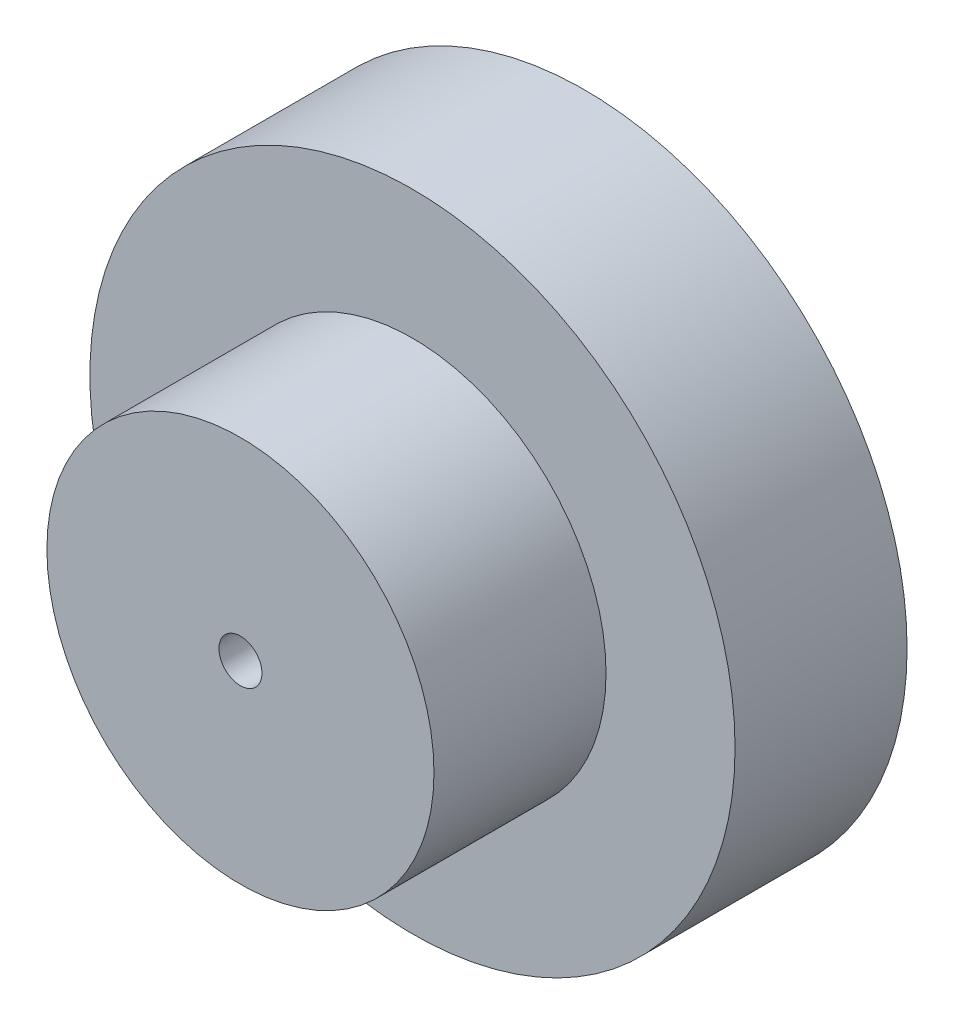
ISO-10303-21;
HEADER;
FILE_DESCRIPTION(('STEP AP214'),'2;1');
FILE_NAME('part.step','',(''),(''),'','','');
FILE_SCHEMA(('AUTOMOTIVE_DESIGN { 1 0 10303 214 1 1 1 1 }'));
ENDSEC;
DATA;
#1=APPLICATION_CONTEXT('core data for automotive mechanical design processes');
#2=APPLICATION_PROTOCOL_DEFINITION('international standard','automotive_design',2000,#1);
#3=PRODUCT_CONTEXT('',#1,'mechanical');
#4=PRODUCT('Part','Part','',(#3));
#5=PRODUCT_RELATED_PRODUCT_CATEGORY('part','',(#4));
#6=PRODUCT_DEFINITION_FORMATION('','',#4);
#7=PRODUCT_DEFINITION_CONTEXT('part definition',#1,'design');
#8=PRODUCT_DEFINITION('design','',#6,#7);
#9=PRODUCT_DEFINITION_SHAPE('','',#8);
#10=(LENGTH_UNIT() NAMED_UNIT(*) SI_UNIT(.MILLI.,.METRE.));
#11=(NAMED_UNIT(*) PLANE_ANGLE_UNIT() SI_UNIT($,.RADIAN.));
#12=(NAMED_UNIT(*) SI_UNIT($,.STERADIAN.) SOLID_ANGLE_UNIT());
#13=UNCERTAINTY_MEASURE_WITH_UNIT(LENGTH_MEASURE(1.E-05),#10,'distance_accuracy_value','');
#14=(GEOMETRIC_REPRESENTATION_CONTEXT(3) GLOBAL_UNCERTAINTY_ASSIGNED_CONTEXT((#13)) GLOBAL_UNIT_ASSIGNED_CONTEXT((#10,
#11,#12)) REPRESENTATION_CONTEXT('',''));
#15=CARTESIAN_POINT('',(0.,0.,0.));
#16=DIRECTION('',(0.,0.,1.));
#17=DIRECTION('',(1.,0.,0.));
#18=AXIS2_PLACEMENT_3D('',#15,#16,#17);
#19=CARTESIAN_POINT('',(0.,0.,0.));
#20=DIRECTION('',(0.,0.,1.));
#21=DIRECTION('',(1.,0.,0.));
#22=AXIS2_PLACEMENT_3D('',#19,#20,#21);
#23=PLANE('',#22);
#24=CARTESIAN_POINT('',(0.,0.,0.));
#25=DIRECTION('',(0.,0.,1.));
#26=DIRECTION('',(1.,0.,0.));
#27=AXIS2_PLACEMENT_3D('',#24,#25,#26);
#28=CIRCLE('',#27,7.5);
#29=CARTESIAN_POINT('',(7.5,0.,0.));
#30=VERTEX_POINT('',#29);
#31=EDGE_CURVE('E51',#30,#30,#28,.T.);
#32=ORIENTED_EDGE('',*,*,#31,.F.);
#33=EDGE_LOOP('',(#32));
#34=FACE_BOUND('',#33,.T.);
#35=CARTESIAN_POINT('',(0.,0.,0.));
#36=DIRECTION('',(0.,0.,-1.));
#37=DIRECTION('',(-1.,0.,0.));
#38=AXIS2_PLACEMENT_3D('',#35,#36,#37);
#39=CIRCLE('',#38,3.);
#40=CARTESIAN_POINT('',(-3.,0.,0.));
#41=VERTEX_POINT('',#40);
#42=EDGE_CURVE('E62',#41,#41,#39,.T.);
#43=ORIENTED_EDGE('',*,*,#42,.F.);
#44=EDGE_LOOP('',(#43));
#45=FACE_BOUND('',#44,.T.);
#46=ADVANCED_FACE('F38',(#34,#45),#23,.F.);
#47=CARTESIAN_POINT('',(0.,0.,8.));
#48=DIRECTION('',(0.,0.,-1.));
#49=DIRECTION('',(-1.,0.,0.));
#50=AXIS2_PLACEMENT_3D('',#47,#48,#49);
#51=CYLINDRICAL_SURFACE('',#50,4.5);
#52=CARTESIAN_POINT('',(0.,0.,4.));
#53=DIRECTION('',(0.,0.,1.));
#54=DIRECTION('',(1.,0.,0.));
#55=AXIS2_PLACEMENT_3D('',#52,#53,#54);
#56=CIRCLE('',#55,4.5);
#57=CARTESIAN_POINT('',(4.5,0.,4.));
#58=VERTEX_POINT('',#57);
#59=EDGE_CURVE('E42',#58,#58,#56,.T.);
#60=ORIENTED_EDGE('',*,*,#59,.T.);
#61=EDGE_LOOP('',(#60));
#62=FACE_BOUND('',#61,.T.);
#63=CARTESIAN_POINT('',(0.,0.,8.));
#64=DIRECTION('',(0.,0.,1.));
#65=DIRECTION('',(1.,0.,0.));
#66=AXIS2_PLACEMENT_3D('',#63,#64,#65);
#67=CIRCLE('',#66,4.5);
#68=CARTESIAN_POINT('',(4.5,0.,8.));
#69=VERTEX_POINT('',#68);
#70=EDGE_CURVE('E10',#69,#69,#67,.T.);
#71=ORIENTED_EDGE('',*,*,#70,.F.);
#72=EDGE_LOOP('',(#71));
#73=FACE_BOUND('',#72,.T.);
#74=ADVANCED_FACE('F40',(#62,#73),#51,.T.);
#75=CARTESIAN_POINT('',(0.,0.,8.));
#76=DIRECTION('',(0.,0.,1.));
#77=DIRECTION('',(1.,0.,0.));
#78=AXIS2_PLACEMENT_3D('',#75,#76,#77);
#79=PLANE('',#78);
#80=CARTESIAN_POINT('',(0.,0.,8.));
#81=DIRECTION('',(0.,0.,-1.));
#82=DIRECTION('',(-1.,0.,0.));
#83=AXIS2_PLACEMENT_3D('',#80,#81,#82);
#84=CIRCLE('',#83,0.499999999999995);
#85=CARTESIAN_POINT('',(-0.499999999999995,0.,8.));
#86=VERTEX_POINT('',#85);
#87=EDGE_CURVE('E54',#86,#86,#84,.T.);
#88=ORIENTED_EDGE('',*,*,#87,.T.);
#89=EDGE_LOOP('',(#88));
#90=FACE_BOUND('',#89,.T.);
#91=ORIENTED_EDGE('',*,*,#70,.T.);
#92=EDGE_LOOP('',(#91));
#93=FACE_BOUND('',#92,.T.);
#94=ADVANCED_FACE('F75',(#90,#93),#79,.T.);
#95=CARTESIAN_POINT('',(0.,0.,4.));
#96=DIRECTION('',(0.,0.,-1.));
#97=DIRECTION('',(-1.,0.,0.));
#98=AXIS2_PLACEMENT_3D('',#95,#96,#97);
#99=CYLINDRICAL_SURFACE('',#98,7.5);
#100=CARTESIAN_POINT('',(0.,0.,4.));
#101=DIRECTION('',(0.,0.,1.));
#102=DIRECTION('',(1.,0.,0.));
#103=AXIS2_PLACEMENT_3D('',#100,#101,#102);
#104=CIRCLE('',#103,7.5);
#105=CARTESIAN_POINT('',(7.5,0.,4.));
#106=VERTEX_POINT('',#105);
#107=EDGE_CURVE('E49',#106,#106,#104,.T.);
#108=ORIENTED_EDGE('',*,*,#107,.F.);
#109=EDGE_LOOP('',(#108));
#110=FACE_BOUND('',#109,.T.);
#111=ORIENTED_EDGE('',*,*,#31,.T.);
#112=EDGE_LOOP('',(#111));
#113=FACE_BOUND('',#112,.T.);
#114=ADVANCED_FACE('F80',(#110,#113),#99,.T.);
#115=CARTESIAN_POINT('',(0.,0.,4.));
#116=DIRECTION('',(0.,0.,1.));
#117=DIRECTION('',(1.,0.,0.));
#118=AXIS2_PLACEMENT_3D('',#115,#116,#117);
#119=PLANE('',#118);
#120=ORIENTED_EDGE('',*,*,#59,.F.);
#121=EDGE_LOOP('',(#120));
#122=FACE_BOUND('',#121,.T.);
#123=ORIENTED_EDGE('',*,*,#107,.T.);
#124=EDGE_LOOP('',(#123));
#125=FACE_BOUND('',#124,.T.);
#126=ADVANCED_FACE('F84',(#122,#125),#119,.T.);
#127=CARTESIAN_POINT('',(0.,0.,0.));
#128=DIRECTION('',(0.,0.,-1.));
#129=DIRECTION('',(-1.,0.,0.));
#130=AXIS2_PLACEMENT_3D('',#127,#128,#129);
#131=CYLINDRICAL_SURFACE('',#130,0.499999999999995);
#132=ORIENTED_EDGE('',*,*,#87,.F.);
#133=EDGE_LOOP('',(#132));
#134=FACE_BOUND('',#133,.T.);
#135=CARTESIAN_POINT('',(0.,0.,2.5));
#136=DIRECTION('',(0.,0.,-1.));
#137=DIRECTION('',(-1.,0.,0.));
#138=AXIS2_PLACEMENT_3D('',#135,#136,#137);
#139=CIRCLE('',#138,0.499999999999995);
#140=CARTESIAN_POINT('',(-0.499999999999995,0.,2.5));
#141=VERTEX_POINT('',#140);
#142=EDGE_CURVE('E59',#141,#141,#139,.T.);
#143=ORIENTED_EDGE('',*,*,#142,.T.);
#144=EDGE_LOOP('',(#143));
#145=FACE_BOUND('',#144,.T.);
#146=ADVANCED_FACE('F87',(#134,#145),#131,.F.);
#147=CARTESIAN_POINT('',(0.,0.,0.));
#148=DIRECTION('',(0.,0.,-1.));
#149=DIRECTION('',(-1.,0.,0.));
#150=AXIS2_PLACEMENT_3D('',#147,#148,#149);
#151=CONICAL_SURFACE('',#150,3.,0.785398163397449);
#152=CARTESIAN_POINT('',(-0.499999999999995,0.,2.5));
#153=CARTESIAN_POINT('',(-0.526041666666662,0.,2.47395833333334));
#154=CARTESIAN_POINT('',(-0.552083333333329,0.,2.44791666666667));
#155=CARTESIAN_POINT('',(-0.604166666666662,0.,2.39583333333334));
#156=CARTESIAN_POINT('',(-0.630208333333329,0.,2.36979166666667));
#157=CARTESIAN_POINT('',(-0.682291666666662,0.,2.31770833333334));
#158=CARTESIAN_POINT('',(-0.708333333333329,0.,2.29166666666667));
#159=CARTESIAN_POINT('',(-0.760416666666662,0.,2.23958333333334));
#160=CARTESIAN_POINT('',(-0.786458333333329,0.,2.21354166666667));
#161=CARTESIAN_POINT('',(-0.838541666666662,0.,2.16145833333334));
#162=CARTESIAN_POINT('',(-0.864583333333329,0.,2.13541666666667));
#163=CARTESIAN_POINT('',(-0.916666666666663,0.,2.08333333333334));
#164=CARTESIAN_POINT('',(-0.942708333333329,0.,2.05729166666667));
#165=CARTESIAN_POINT('',(-0.994791666666663,0.,2.00520833333333));
#166=CARTESIAN_POINT('',(-1.02083333333333,0.,1.97916666666667));
#167=CARTESIAN_POINT('',(-1.07291666666666,0.,1.92708333333334));
#168=CARTESIAN_POINT('',(-1.09895833333333,0.,1.90104166666667));
#169=CARTESIAN_POINT('',(-1.15104166666666,0.,1.84895833333334));
#170=CARTESIAN_POINT('',(-1.17708333333333,0.,1.82291666666667));
#171=CARTESIAN_POINT('',(-1.22916666666666,0.,1.77083333333334));
#172=CARTESIAN_POINT('',(-1.25520833333333,0.,1.74479166666667));
#173=CARTESIAN_POINT('',(-1.30729166666666,0.,1.69270833333333));
#174=CARTESIAN_POINT('',(-1.33333333333333,0.,1.66666666666667));
#175=CARTESIAN_POINT('',(-1.38541666666666,0.,1.61458333333333));
#176=CARTESIAN_POINT('',(-1.41145833333333,0.,1.58854166666667));
#177=CARTESIAN_POINT('',(-1.46354166666666,0.,1.53645833333333));
#178=CARTESIAN_POINT('',(-1.48958333333333,0.,1.51041666666667));
#179=CARTESIAN_POINT('',(-1.54166666666666,0.,1.45833333333333));
#180=CARTESIAN_POINT('',(-1.56770833333333,0.,1.43229166666667));
#181=CARTESIAN_POINT('',(-1.61979166666666,0.,1.38020833333333));
#182=CARTESIAN_POINT('',(-1.64583333333333,0.,1.35416666666667));
#183=CARTESIAN_POINT('',(-1.69791666666666,0.,1.30208333333333));
#184=CARTESIAN_POINT('',(-1.72395833333333,0.,1.27604166666667));
#185=CARTESIAN_POINT('',(-1.77604166666666,0.,1.22395833333333));
#186=CARTESIAN_POINT('',(-1.80208333333333,0.,1.19791666666667));
#187=CARTESIAN_POINT('',(-1.85416666666666,0.,1.14583333333333));
#188=CARTESIAN_POINT('',(-1.88020833333333,0.,1.11979166666667));
#189=CARTESIAN_POINT('',(-1.93229166666666,0.,1.06770833333333));
#190=CARTESIAN_POINT('',(-1.95833333333333,0.,1.04166666666667));
#191=CARTESIAN_POINT('',(-2.01041666666667,0.,0.989583333333334));
#192=CARTESIAN_POINT('',(-2.03645833333333,0.,0.963541666666668));
#193=CARTESIAN_POINT('',(-2.08854166666667,0.,0.911458333333334));
#194=CARTESIAN_POINT('',(-2.11458333333333,0.,0.885416666666668));
#195=CARTESIAN_POINT('',(-2.16666666666667,0.,0.833333333333334));
#196=CARTESIAN_POINT('',(-2.19270833333333,0.,0.807291666666667));
#197=CARTESIAN_POINT('',(-2.24479166666667,0.,0.755208333333334));
#198=CARTESIAN_POINT('',(-2.27083333333333,0.,0.729166666666667));
#199=CARTESIAN_POINT('',(-2.32291666666667,0.,0.677083333333334));
#200=CARTESIAN_POINT('',(-2.34895833333333,0.,0.651041666666667));
#201=CARTESIAN_POINT('',(-2.40104166666667,0.,0.598958333333334));
#202=CARTESIAN_POINT('',(-2.42708333333333,0.,0.572916666666667));
#203=CARTESIAN_POINT('',(-2.47916666666667,0.,0.520833333333334));
#204=CARTESIAN_POINT('',(-2.50520833333333,0.,0.494791666666667));
#205=CARTESIAN_POINT('',(-2.55729166666667,0.,0.442708333333334));
#206=CARTESIAN_POINT('',(-2.58333333333333,0.,0.416666666666667));
#207=CARTESIAN_POINT('',(-2.63541666666667,0.,0.364583333333334));
#208=CARTESIAN_POINT('',(-2.66145833333333,0.,0.338541666666667));
#209=CARTESIAN_POINT('',(-2.71354166666667,0.,0.286458333333334));
#210=CARTESIAN_POINT('',(-2.73958333333333,0.,0.260416666666667));
#211=CARTESIAN_POINT('',(-2.79166666666667,0.,0.208333333333333));
#212=CARTESIAN_POINT('',(-2.81770833333333,0.,0.182291666666667));
#213=CARTESIAN_POINT('',(-2.86979166666667,0.,0.130208333333333));
#214=CARTESIAN_POINT('',(-2.89583333333333,0.,0.104166666666667));
#215=CARTESIAN_POINT('',(-2.94791666666667,0.,0.0520833333333334));
#216=CARTESIAN_POINT('',(-2.97395833333333,0.,0.0260416666666666));
#217=CARTESIAN_POINT('',(-3.,0.,0.));
#218=B_SPLINE_CURVE_WITH_KNOTS('',3,(#152,#153,#154,#155,#156,#157,#158,#159,#160,#161,#162,
#163,#164,#165,#166,#167,#168,#169,#170,#171,#172,#173,#174,#175,#176,#177,#178,#179,#180,#181,
#182,#183,#184,#185,#186,#187,#188,#189,#190,#191,#192,#193,#194,#195,#196,#197,#198,#199,#200,
#201,#202,#203,#204,#205,#206,#207,#208,#209,#210,#211,#212,#213,#214,#215,#216,#217),
.UNSPECIFIED.,.F.,.F.,(4,2,2,2,2,2,2,2,2,2,2,2,2,2,2,2,2,2,2,2,2,2,2,2,2,2,2,2,2,2,2,2,4),(0.,
0.110485434560398,0.220970869120796,0.331456303681194,0.441941738241593,0.552427172801991,
0.662912607362389,0.773398041922787,0.883883476483185,0.994368911043584,1.10485434560398,
1.21533978016438,1.32582521472478,1.43631064928518,1.54679608384557,1.65728151840597,
1.76776695296637,1.87825238752677,1.98873782208717,2.09922325664757,2.20970869120796,
2.32019412576836,2.43067956032876,2.54116499488916,2.65165042944956,2.76213586400995,
2.87262129857035,2.98310673313075,3.09359216769115,3.20407760225155,3.31456303681195,
3.42504847137234,3.53553390593274),.UNSPECIFIED.);
#219=EDGE_CURVE('BSEAM66',#141,#41,#218,.T.);
#220=ORIENTED_EDGE('',*,*,#142,.F.);
#221=ORIENTED_EDGE('',*,*,#42,.T.);
#222=ORIENTED_EDGE('',*,*,#219,.T.);
#223=ORIENTED_EDGE('',*,*,#219,.F.);
#224=EDGE_LOOP('',(#220,#222,#221,#223));
#225=FACE_BOUND('',#224,.T.);
#226=ADVANCED_FACE('F66',(#225),#151,.F.);
#227=CLOSED_SHELL('',(#46,#74,#94,#114,#126,#146,#226));
#228=MANIFOLD_SOLID_BREP('B2',#227);
#229=ADVANCED_BREP_SHAPE_REPRESENTATION('',(#18,#228),#14);
#230=SHAPE_DEFINITION_REPRESENTATION(#9,#229);
ENDSEC;
END-ISO-10303-21;
